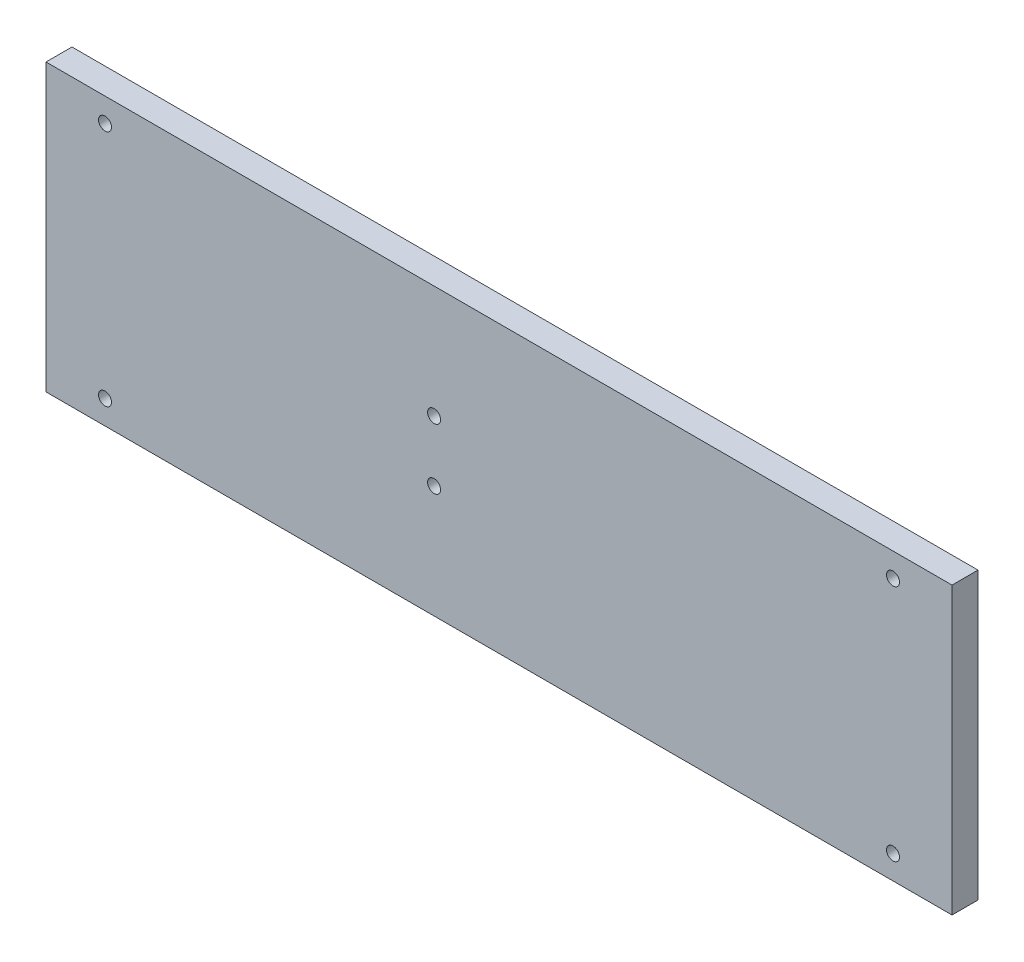
ISO-10303-21;
HEADER;
FILE_DESCRIPTION(('STEP AP214'),'2;1');
FILE_NAME('part.step','',(''),(''),'','','');
FILE_SCHEMA(('AUTOMOTIVE_DESIGN { 1 0 10303 214 1 1 1 1 }'));
ENDSEC;
DATA;
#1=APPLICATION_CONTEXT('core data for automotive mechanical design processes');
#2=APPLICATION_PROTOCOL_DEFINITION('international standard','automotive_design',2000,#1);
#3=PRODUCT_CONTEXT('',#1,'mechanical');
#4=PRODUCT('Part','Part','',(#3));
#5=PRODUCT_RELATED_PRODUCT_CATEGORY('part','',(#4));
#6=PRODUCT_DEFINITION_FORMATION('','',#4);
#7=PRODUCT_DEFINITION_CONTEXT('part definition',#1,'design');
#8=PRODUCT_DEFINITION('design','',#6,#7);
#9=PRODUCT_DEFINITION_SHAPE('','',#8);
#10=(LENGTH_UNIT() NAMED_UNIT(*) SI_UNIT(.MILLI.,.METRE.));
#11=(NAMED_UNIT(*) PLANE_ANGLE_UNIT() SI_UNIT($,.RADIAN.));
#12=(NAMED_UNIT(*) SI_UNIT($,.STERADIAN.) SOLID_ANGLE_UNIT());
#13=UNCERTAINTY_MEASURE_WITH_UNIT(LENGTH_MEASURE(1.E-05),#10,'distance_accuracy_value','');
#14=(GEOMETRIC_REPRESENTATION_CONTEXT(3) GLOBAL_UNCERTAINTY_ASSIGNED_CONTEXT((#13)) GLOBAL_UNIT_ASSIGNED_CONTEXT((#10,
#11,#12)) REPRESENTATION_CONTEXT('',''));
#15=CARTESIAN_POINT('',(0.,0.,0.));
#16=DIRECTION('',(0.,0.,1.));
#17=DIRECTION('',(1.,0.,0.));
#18=AXIS2_PLACEMENT_3D('',#15,#16,#17);
#19=CARTESIAN_POINT('',(-104.63,33.,6.));
#20=DIRECTION('',(1.,0.,0.));
#21=DIRECTION('',(0.,1.,0.));
#22=AXIS2_PLACEMENT_3D('',#19,#20,#21);
#23=PLANE('',#22);
#24=DIRECTION('',(0.,-1.,0.));
#25=VECTOR('',#24,1.);
#26=CARTESIAN_POINT('',(-104.63,33.,0.));
#27=LINE('',#26,#25);
#28=CARTESIAN_POINT('',(-104.63,33.,0.));
#29=VERTEX_POINT('',#28);
#30=CARTESIAN_POINT('',(-104.63,-33.,0.));
#31=VERTEX_POINT('',#30);
#32=EDGE_CURVE('E96',#29,#31,#27,.T.);
#33=ORIENTED_EDGE('',*,*,#32,.T.);
#34=DIRECTION('',(0.,0.,-1.));
#35=VECTOR('',#34,1.);
#36=CARTESIAN_POINT('',(-104.63,-33.,6.));
#37=LINE('',#36,#35);
#38=CARTESIAN_POINT('',(-104.63,-33.,6.));
#39=VERTEX_POINT('',#38);
#40=EDGE_CURVE('E11',#39,#31,#37,.T.);
#41=ORIENTED_EDGE('',*,*,#40,.F.);
#42=DIRECTION('',(0.,-1.,0.));
#43=VECTOR('',#42,1.);
#44=CARTESIAN_POINT('',(-104.63,33.,6.));
#45=LINE('',#44,#43);
#46=CARTESIAN_POINT('',(-104.63,33.,6.));
#47=VERTEX_POINT('',#46);
#48=EDGE_CURVE('E84',#47,#39,#45,.T.);
#49=ORIENTED_EDGE('',*,*,#48,.F.);
#50=DIRECTION('',(0.,0.,-1.));
#51=VECTOR('',#50,1.);
#52=CARTESIAN_POINT('',(-104.63,33.,6.));
#53=LINE('',#52,#51);
#54=EDGE_CURVE('E92',#47,#29,#53,.T.);
#55=ORIENTED_EDGE('',*,*,#54,.T.);
#56=EDGE_LOOP('',(#33,#41,#49,#55));
#57=FACE_BOUND('',#56,.T.);
#58=ADVANCED_FACE('F33',(#57),#23,.F.);
#59=CARTESIAN_POINT('',(-104.63,-33.,6.));
#60=DIRECTION('',(0.,1.,0.));
#61=DIRECTION('',(0.,0.,1.));
#62=AXIS2_PLACEMENT_3D('',#59,#60,#61);
#63=PLANE('',#62);
#64=DIRECTION('',(1.,0.,0.));
#65=VECTOR('',#64,1.);
#66=CARTESIAN_POINT('',(-104.63,-33.,0.));
#67=LINE('',#66,#65);
#68=CARTESIAN_POINT('',(104.63,-33.,0.));
#69=VERTEX_POINT('',#68);
#70=EDGE_CURVE('E88',#31,#69,#67,.T.);
#71=ORIENTED_EDGE('',*,*,#70,.T.);
#72=DIRECTION('',(0.,0.,-1.));
#73=VECTOR('',#72,1.);
#74=CARTESIAN_POINT('',(104.63,-33.,6.));
#75=LINE('',#74,#73);
#76=CARTESIAN_POINT('',(104.63,-33.,6.));
#77=VERTEX_POINT('',#76);
#78=EDGE_CURVE('E41',#77,#69,#75,.T.);
#79=ORIENTED_EDGE('',*,*,#78,.F.);
#80=DIRECTION('',(1.,0.,0.));
#81=VECTOR('',#80,1.);
#82=CARTESIAN_POINT('',(-104.63,-33.,6.));
#83=LINE('',#82,#81);
#84=EDGE_CURVE('E79',#39,#77,#83,.T.);
#85=ORIENTED_EDGE('',*,*,#84,.F.);
#86=ORIENTED_EDGE('',*,*,#40,.T.);
#87=EDGE_LOOP('',(#71,#79,#85,#86));
#88=FACE_BOUND('',#87,.T.);
#89=ADVANCED_FACE('F87',(#88),#63,.F.);
#90=CARTESIAN_POINT('',(104.63,33.,6.));
#91=DIRECTION('',(-1.,0.,0.));
#92=DIRECTION('',(0.,-1.,0.));
#93=AXIS2_PLACEMENT_3D('',#90,#91,#92);
#94=PLANE('',#93);
#95=DIRECTION('',(0.,1.,0.));
#96=VECTOR('',#95,1.);
#97=CARTESIAN_POINT('',(104.63,33.,0.));
#98=LINE('',#97,#96);
#99=CARTESIAN_POINT('',(104.63,33.,0.));
#100=VERTEX_POINT('',#99);
#101=EDGE_CURVE('E66',#69,#100,#98,.T.);
#102=ORIENTED_EDGE('',*,*,#101,.T.);
#103=DIRECTION('',(0.,0.,-1.));
#104=VECTOR('',#103,1.);
#105=CARTESIAN_POINT('',(104.63,33.,6.));
#106=LINE('',#105,#104);
#107=CARTESIAN_POINT('',(104.63,33.,6.));
#108=VERTEX_POINT('',#107);
#109=EDGE_CURVE('E89',#108,#100,#106,.T.);
#110=ORIENTED_EDGE('',*,*,#109,.F.);
#111=DIRECTION('',(0.,1.,0.));
#112=VECTOR('',#111,1.);
#113=CARTESIAN_POINT('',(104.63,33.,6.));
#114=LINE('',#113,#112);
#115=EDGE_CURVE('E82',#77,#108,#114,.T.);
#116=ORIENTED_EDGE('',*,*,#115,.F.);
#117=ORIENTED_EDGE('',*,*,#78,.T.);
#118=EDGE_LOOP('',(#102,#110,#116,#117));
#119=FACE_BOUND('',#118,.T.);
#120=ADVANCED_FACE('F90',(#119),#94,.F.);
#121=CARTESIAN_POINT('',(-104.63,33.,6.));
#122=DIRECTION('',(0.,-1.,0.));
#123=DIRECTION('',(0.,0.,-1.));
#124=AXIS2_PLACEMENT_3D('',#121,#122,#123);
#125=PLANE('',#124);
#126=DIRECTION('',(-1.,0.,0.));
#127=VECTOR('',#126,1.);
#128=CARTESIAN_POINT('',(-104.63,33.,0.));
#129=LINE('',#128,#127);
#130=EDGE_CURVE('E72',#100,#29,#129,.T.);
#131=ORIENTED_EDGE('',*,*,#130,.T.);
#132=ORIENTED_EDGE('',*,*,#54,.F.);
#133=DIRECTION('',(-1.,0.,0.));
#134=VECTOR('',#133,1.);
#135=CARTESIAN_POINT('',(-104.63,33.,6.));
#136=LINE('',#135,#134);
#137=EDGE_CURVE('E49',#108,#47,#136,.T.);
#138=ORIENTED_EDGE('',*,*,#137,.F.);
#139=ORIENTED_EDGE('',*,*,#109,.T.);
#140=EDGE_LOOP('',(#131,#132,#138,#139));
#141=FACE_BOUND('',#140,.T.);
#142=ADVANCED_FACE('F104',(#141),#125,.F.);
#143=CARTESIAN_POINT('',(0.,0.,6.));
#144=DIRECTION('',(0.,0.,1.));
#145=DIRECTION('',(1.,0.,0.));
#146=AXIS2_PLACEMENT_3D('',#143,#144,#145);
#147=PLANE('',#146);
#148=CARTESIAN_POINT('',(-91.,27.5,6.));
#149=DIRECTION('',(0.,0.,1.));
#150=DIRECTION('',(-1.,0.,0.));
#151=AXIS2_PLACEMENT_3D('',#148,#149,#150);
#152=CIRCLE('',#151,1.5);
#153=CARTESIAN_POINT('',(-92.5,27.5,6.));
#154=VERTEX_POINT('',#153);
#155=EDGE_CURVE('E140',#154,#154,#152,.T.);
#156=ORIENTED_EDGE('',*,*,#155,.F.);
#157=EDGE_LOOP('',(#156));
#158=FACE_BOUND('',#157,.T.);
#159=CARTESIAN_POINT('',(-91.,-27.5,6.));
#160=DIRECTION('',(0.,0.,1.));
#161=DIRECTION('',(-1.,0.,0.));
#162=AXIS2_PLACEMENT_3D('',#159,#160,#161);
#163=CIRCLE('',#162,1.5);
#164=CARTESIAN_POINT('',(-92.5,-27.5,6.));
#165=VERTEX_POINT('',#164);
#166=EDGE_CURVE('E134',#165,#165,#163,.T.);
#167=ORIENTED_EDGE('',*,*,#166,.F.);
#168=EDGE_LOOP('',(#167));
#169=FACE_BOUND('',#168,.T.);
#170=CARTESIAN_POINT('',(91.,-27.5,6.));
#171=DIRECTION('',(0.,0.,1.));
#172=DIRECTION('',(1.,0.,0.));
#173=AXIS2_PLACEMENT_3D('',#170,#171,#172);
#174=CIRCLE('',#173,1.5);
#175=CARTESIAN_POINT('',(92.5,-27.5,6.));
#176=VERTEX_POINT('',#175);
#177=EDGE_CURVE('E128',#176,#176,#174,.T.);
#178=ORIENTED_EDGE('',*,*,#177,.F.);
#179=EDGE_LOOP('',(#178));
#180=FACE_BOUND('',#179,.T.);
#181=CARTESIAN_POINT('',(91.,27.5,6.));
#182=DIRECTION('',(0.,0.,1.));
#183=DIRECTION('',(1.,0.,0.));
#184=AXIS2_PLACEMENT_3D('',#181,#182,#183);
#185=CIRCLE('',#184,1.5);
#186=CARTESIAN_POINT('',(92.5,27.5,6.));
#187=VERTEX_POINT('',#186);
#188=EDGE_CURVE('E122',#187,#187,#185,.T.);
#189=ORIENTED_EDGE('',*,*,#188,.F.);
#190=EDGE_LOOP('',(#189));
#191=FACE_BOUND('',#190,.T.);
#192=CARTESIAN_POINT('',(-15.,-7.,6.));
#193=DIRECTION('',(0.,0.,1.));
#194=DIRECTION('',(1.,0.,0.));
#195=AXIS2_PLACEMENT_3D('',#192,#193,#194);
#196=CIRCLE('',#195,1.5);
#197=CARTESIAN_POINT('',(-13.5,-7.,6.));
#198=VERTEX_POINT('',#197);
#199=EDGE_CURVE('E116',#198,#198,#196,.T.);
#200=ORIENTED_EDGE('',*,*,#199,.F.);
#201=EDGE_LOOP('',(#200));
#202=FACE_BOUND('',#201,.T.);
#203=CARTESIAN_POINT('',(-15.,7.,6.));
#204=DIRECTION('',(0.,0.,1.));
#205=DIRECTION('',(1.,0.,0.));
#206=AXIS2_PLACEMENT_3D('',#203,#204,#205);
#207=CIRCLE('',#206,1.5);
#208=CARTESIAN_POINT('',(-13.5,7.,6.));
#209=VERTEX_POINT('',#208);
#210=EDGE_CURVE('E110',#209,#209,#207,.T.);
#211=ORIENTED_EDGE('',*,*,#210,.F.);
#212=EDGE_LOOP('',(#211));
#213=FACE_BOUND('',#212,.T.);
#214=ORIENTED_EDGE('',*,*,#48,.T.);
#215=ORIENTED_EDGE('',*,*,#84,.T.);
#216=ORIENTED_EDGE('',*,*,#115,.T.);
#217=ORIENTED_EDGE('',*,*,#137,.T.);
#218=EDGE_LOOP('',(#214,#215,#216,#217));
#219=FACE_BOUND('',#218,.T.);
#220=ADVANCED_FACE('F80',(#158,#169,#180,#191,#202,#213,#219),#147,.T.);
#221=CARTESIAN_POINT('',(0.,0.,0.));
#222=DIRECTION('',(0.,0.,1.));
#223=DIRECTION('',(1.,0.,0.));
#224=AXIS2_PLACEMENT_3D('',#221,#222,#223);
#225=PLANE('',#224);
#226=CARTESIAN_POINT('',(-91.,27.5,0.));
#227=DIRECTION('',(0.,0.,1.));
#228=DIRECTION('',(-1.,0.,0.));
#229=AXIS2_PLACEMENT_3D('',#226,#227,#228);
#230=CIRCLE('',#229,1.5);
#231=CARTESIAN_POINT('',(-92.5,27.5,0.));
#232=VERTEX_POINT('',#231);
#233=EDGE_CURVE('E137',#232,#232,#230,.T.);
#234=ORIENTED_EDGE('',*,*,#233,.T.);
#235=EDGE_LOOP('',(#234));
#236=FACE_BOUND('',#235,.T.);
#237=CARTESIAN_POINT('',(-91.,-27.5,0.));
#238=DIRECTION('',(0.,0.,1.));
#239=DIRECTION('',(-1.,0.,0.));
#240=AXIS2_PLACEMENT_3D('',#237,#238,#239);
#241=CIRCLE('',#240,1.5);
#242=CARTESIAN_POINT('',(-92.5,-27.5,0.));
#243=VERTEX_POINT('',#242);
#244=EDGE_CURVE('E131',#243,#243,#241,.T.);
#245=ORIENTED_EDGE('',*,*,#244,.T.);
#246=EDGE_LOOP('',(#245));
#247=FACE_BOUND('',#246,.T.);
#248=CARTESIAN_POINT('',(91.,-27.5,0.));
#249=DIRECTION('',(0.,0.,1.));
#250=DIRECTION('',(1.,0.,0.));
#251=AXIS2_PLACEMENT_3D('',#248,#249,#250);
#252=CIRCLE('',#251,1.5);
#253=CARTESIAN_POINT('',(92.5,-27.5,0.));
#254=VERTEX_POINT('',#253);
#255=EDGE_CURVE('E125',#254,#254,#252,.T.);
#256=ORIENTED_EDGE('',*,*,#255,.T.);
#257=EDGE_LOOP('',(#256));
#258=FACE_BOUND('',#257,.T.);
#259=CARTESIAN_POINT('',(91.,27.5,0.));
#260=DIRECTION('',(0.,0.,1.));
#261=DIRECTION('',(1.,0.,0.));
#262=AXIS2_PLACEMENT_3D('',#259,#260,#261);
#263=CIRCLE('',#262,1.5);
#264=CARTESIAN_POINT('',(92.5,27.5,0.));
#265=VERTEX_POINT('',#264);
#266=EDGE_CURVE('E119',#265,#265,#263,.T.);
#267=ORIENTED_EDGE('',*,*,#266,.T.);
#268=EDGE_LOOP('',(#267));
#269=FACE_BOUND('',#268,.T.);
#270=CARTESIAN_POINT('',(-15.,-7.,0.));
#271=DIRECTION('',(0.,0.,1.));
#272=DIRECTION('',(1.,0.,0.));
#273=AXIS2_PLACEMENT_3D('',#270,#271,#272);
#274=CIRCLE('',#273,1.5);
#275=CARTESIAN_POINT('',(-13.5,-7.,0.));
#276=VERTEX_POINT('',#275);
#277=EDGE_CURVE('E113',#276,#276,#274,.T.);
#278=ORIENTED_EDGE('',*,*,#277,.T.);
#279=EDGE_LOOP('',(#278));
#280=FACE_BOUND('',#279,.T.);
#281=CARTESIAN_POINT('',(-15.,7.,0.));
#282=DIRECTION('',(0.,0.,1.));
#283=DIRECTION('',(1.,0.,0.));
#284=AXIS2_PLACEMENT_3D('',#281,#282,#283);
#285=CIRCLE('',#284,1.5);
#286=CARTESIAN_POINT('',(-13.5,7.,0.));
#287=VERTEX_POINT('',#286);
#288=EDGE_CURVE('E99',#287,#287,#285,.T.);
#289=ORIENTED_EDGE('',*,*,#288,.T.);
#290=EDGE_LOOP('',(#289));
#291=FACE_BOUND('',#290,.T.);
#292=ORIENTED_EDGE('',*,*,#32,.F.);
#293=ORIENTED_EDGE('',*,*,#130,.F.);
#294=ORIENTED_EDGE('',*,*,#101,.F.);
#295=ORIENTED_EDGE('',*,*,#70,.F.);
#296=EDGE_LOOP('',(#292,#293,#294,#295));
#297=FACE_BOUND('',#296,.T.);
#298=ADVANCED_FACE('F107',(#236,#247,#258,#269,#280,#291,#297),#225,.F.);
#299=CARTESIAN_POINT('',(-15.,7.,0.));
#300=DIRECTION('',(0.,0.,1.));
#301=DIRECTION('',(1.,0.,0.));
#302=AXIS2_PLACEMENT_3D('',#299,#300,#301);
#303=CYLINDRICAL_SURFACE('',#302,1.5);
#304=ORIENTED_EDGE('',*,*,#288,.F.);
#305=EDGE_LOOP('',(#304));
#306=FACE_BOUND('',#305,.T.);
#307=ORIENTED_EDGE('',*,*,#210,.T.);
#308=EDGE_LOOP('',(#307));
#309=FACE_BOUND('',#308,.T.);
#310=ADVANCED_FACE('F168',(#306,#309),#303,.F.);
#311=CARTESIAN_POINT('',(-15.,-7.,0.));
#312=DIRECTION('',(0.,0.,1.));
#313=DIRECTION('',(1.,0.,0.));
#314=AXIS2_PLACEMENT_3D('',#311,#312,#313);
#315=CYLINDRICAL_SURFACE('',#314,1.5);
#316=ORIENTED_EDGE('',*,*,#277,.F.);
#317=EDGE_LOOP('',(#316));
#318=FACE_BOUND('',#317,.T.);
#319=ORIENTED_EDGE('',*,*,#199,.T.);
#320=EDGE_LOOP('',(#319));
#321=FACE_BOUND('',#320,.T.);
#322=ADVANCED_FACE('F170',(#318,#321),#315,.F.);
#323=CARTESIAN_POINT('',(91.,27.5,0.));
#324=DIRECTION('',(0.,0.,1.));
#325=DIRECTION('',(1.,0.,0.));
#326=AXIS2_PLACEMENT_3D('',#323,#324,#325);
#327=CYLINDRICAL_SURFACE('',#326,1.5);
#328=ORIENTED_EDGE('',*,*,#266,.F.);
#329=EDGE_LOOP('',(#328));
#330=FACE_BOUND('',#329,.T.);
#331=ORIENTED_EDGE('',*,*,#188,.T.);
#332=EDGE_LOOP('',(#331));
#333=FACE_BOUND('',#332,.T.);
#334=ADVANCED_FACE('F177',(#330,#333),#327,.F.);
#335=CARTESIAN_POINT('',(91.,-27.5,0.));
#336=DIRECTION('',(0.,0.,1.));
#337=DIRECTION('',(1.,0.,0.));
#338=AXIS2_PLACEMENT_3D('',#335,#336,#337);
#339=CYLINDRICAL_SURFACE('',#338,1.5);
#340=ORIENTED_EDGE('',*,*,#255,.F.);
#341=EDGE_LOOP('',(#340));
#342=FACE_BOUND('',#341,.T.);
#343=ORIENTED_EDGE('',*,*,#177,.T.);
#344=EDGE_LOOP('',(#343));
#345=FACE_BOUND('',#344,.T.);
#346=ADVANCED_FACE('F223',(#342,#345),#339,.F.);
#347=CARTESIAN_POINT('',(-91.,-27.5,0.));
#348=DIRECTION('',(0.,0.,1.));
#349=DIRECTION('',(1.,0.,0.));
#350=AXIS2_PLACEMENT_3D('',#347,#348,#349);
#351=CYLINDRICAL_SURFACE('',#350,1.5);
#352=ORIENTED_EDGE('',*,*,#244,.F.);
#353=EDGE_LOOP('',(#352));
#354=FACE_BOUND('',#353,.T.);
#355=ORIENTED_EDGE('',*,*,#166,.T.);
#356=EDGE_LOOP('',(#355));
#357=FACE_BOUND('',#356,.T.);
#358=ADVANCED_FACE('F151',(#354,#357),#351,.F.);
#359=CARTESIAN_POINT('',(-91.,27.5,0.));
#360=DIRECTION('',(0.,0.,1.));
#361=DIRECTION('',(1.,0.,0.));
#362=AXIS2_PLACEMENT_3D('',#359,#360,#361);
#363=CYLINDRICAL_SURFACE('',#362,1.5);
#364=ORIENTED_EDGE('',*,*,#233,.F.);
#365=EDGE_LOOP('',(#364));
#366=FACE_BOUND('',#365,.T.);
#367=ORIENTED_EDGE('',*,*,#155,.T.);
#368=EDGE_LOOP('',(#367));
#369=FACE_BOUND('',#368,.T.);
#370=ADVANCED_FACE('F148',(#366,#369),#363,.F.);
#371=CLOSED_SHELL('',(#58,#89,#120,#142,#220,#298,#310,#322,#334,#346,#358,#370));
#372=MANIFOLD_SOLID_BREP('B2',#371);
#373=ADVANCED_BREP_SHAPE_REPRESENTATION('',(#18,#372),#14);
#374=SHAPE_DEFINITION_REPRESENTATION(#9,#373);
ENDSEC;
END-ISO-10303-21;
